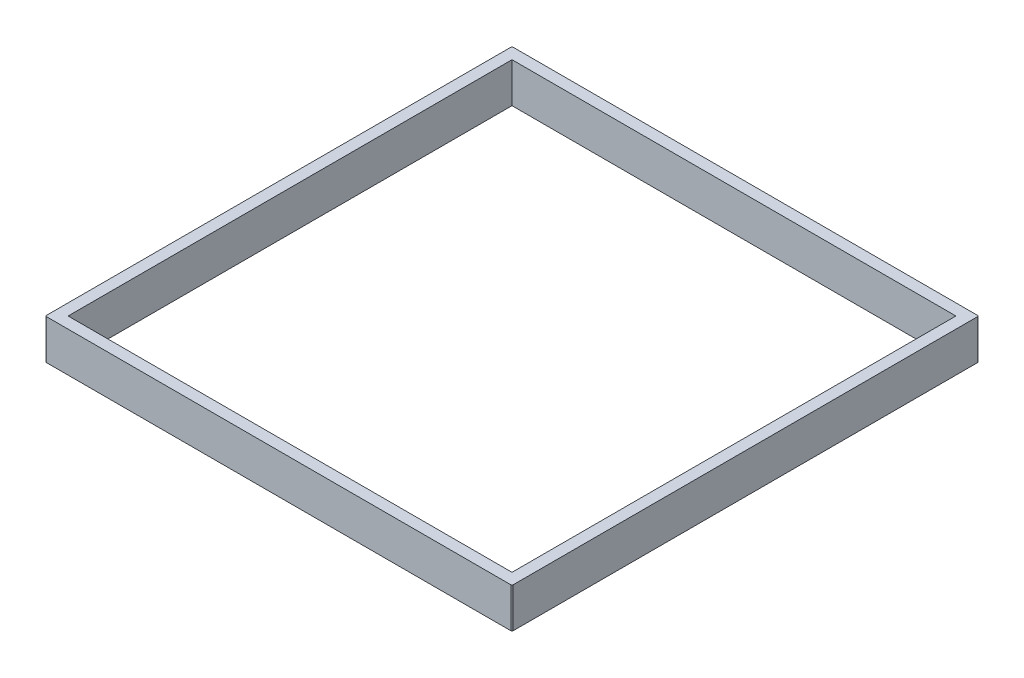
ISO-10303-21;
HEADER;
FILE_DESCRIPTION(('STEP AP214'),'2;1');
FILE_NAME('part.step','',(''),(''),'','','');
FILE_SCHEMA(('AUTOMOTIVE_DESIGN { 1 0 10303 214 1 1 1 1 }'));
ENDSEC;
DATA;
#1=APPLICATION_CONTEXT('core data for automotive mechanical design processes');
#2=APPLICATION_PROTOCOL_DEFINITION('international standard','automotive_design',2000,#1);
#3=PRODUCT_CONTEXT('',#1,'mechanical');
#4=PRODUCT('Part','Part','',(#3));
#5=PRODUCT_RELATED_PRODUCT_CATEGORY('part','',(#4));
#6=PRODUCT_DEFINITION_FORMATION('','',#4);
#7=PRODUCT_DEFINITION_CONTEXT('part definition',#1,'design');
#8=PRODUCT_DEFINITION('design','',#6,#7);
#9=PRODUCT_DEFINITION_SHAPE('','',#8);
#10=(LENGTH_UNIT() NAMED_UNIT(*) SI_UNIT(.MILLI.,.METRE.));
#11=(NAMED_UNIT(*) PLANE_ANGLE_UNIT() SI_UNIT($,.RADIAN.));
#12=(NAMED_UNIT(*) SI_UNIT($,.STERADIAN.) SOLID_ANGLE_UNIT());
#13=UNCERTAINTY_MEASURE_WITH_UNIT(LENGTH_MEASURE(1.E-05),#10,'distance_accuracy_value','');
#14=(GEOMETRIC_REPRESENTATION_CONTEXT(3) GLOBAL_UNCERTAINTY_ASSIGNED_CONTEXT((#13)) GLOBAL_UNIT_ASSIGNED_CONTEXT((#10,
#11,#12)) REPRESENTATION_CONTEXT('',''));
#15=CARTESIAN_POINT('',(0.,0.,0.));
#16=DIRECTION('',(0.,0.,1.));
#17=DIRECTION('',(1.,0.,0.));
#18=AXIS2_PLACEMENT_3D('',#15,#16,#17);
#19=CARTESIAN_POINT('',(81.8,7.,-70.8));
#20=DIRECTION('',(0.,-1.,0.));
#21=DIRECTION('',(0.,0.,-1.));
#22=AXIS2_PLACEMENT_3D('',#19,#20,#21);
#23=PLANE('',#22);
#24=CARTESIAN_POINT('',(81.8,7.,-70.8));
#25=DIRECTION('',(0.,1.,0.));
#26=DIRECTION('',(0.,0.,-1.));
#27=AXIS2_PLACEMENT_3D('',#24,#25,#26);
#28=CIRCLE('',#27,0.200000000000006);
#29=CARTESIAN_POINT('',(82.,7.,-70.8));
#30=VERTEX_POINT('',#29);
#31=CARTESIAN_POINT('',(81.8,7.,-71.));
#32=VERTEX_POINT('',#31);
#33=EDGE_CURVE('E158',#30,#32,#28,.T.);
#34=ORIENTED_EDGE('',*,*,#33,.T.);
#35=DIRECTION('',(-1.,0.,0.));
#36=VECTOR('',#35,1.);
#37=CARTESIAN_POINT('',(0.2,7.,-71.));
#38=LINE('',#37,#36);
#39=CARTESIAN_POINT('',(0.2,7.,-71.));
#40=VERTEX_POINT('',#39);
#41=EDGE_CURVE('E161',#32,#40,#38,.T.);
#42=ORIENTED_EDGE('',*,*,#41,.T.);
#43=CARTESIAN_POINT('',(0.2,7.,-70.8));
#44=DIRECTION('',(0.,1.,0.));
#45=DIRECTION('',(0.,0.,-1.));
#46=AXIS2_PLACEMENT_3D('',#43,#44,#45);
#47=CIRCLE('',#46,0.200000000000003);
#48=CARTESIAN_POINT('',(0.,7.,-70.8));
#49=VERTEX_POINT('',#48);
#50=EDGE_CURVE('E164',#40,#49,#47,.T.);
#51=ORIENTED_EDGE('',*,*,#50,.T.);
#52=DIRECTION('',(0.,0.,1.));
#53=VECTOR('',#52,1.);
#54=CARTESIAN_POINT('',(0.,7.,10.8));
#55=LINE('',#54,#53);
#56=CARTESIAN_POINT('',(0.,7.,10.8));
#57=VERTEX_POINT('',#56);
#58=EDGE_CURVE('E166',#49,#57,#55,.T.);
#59=ORIENTED_EDGE('',*,*,#58,.T.);
#60=CARTESIAN_POINT('',(0.2,7.,10.8));
#61=DIRECTION('',(0.,1.,0.));
#62=DIRECTION('',(0.,0.,-1.));
#63=AXIS2_PLACEMENT_3D('',#60,#61,#62);
#64=CIRCLE('',#63,0.200000000000001);
#65=CARTESIAN_POINT('',(0.2,7.,11.));
#66=VERTEX_POINT('',#65);
#67=EDGE_CURVE('E168',#57,#66,#64,.T.);
#68=ORIENTED_EDGE('',*,*,#67,.T.);
#69=DIRECTION('',(1.,0.,0.));
#70=VECTOR('',#69,1.);
#71=CARTESIAN_POINT('',(0.2,7.,11.));
#72=LINE('',#71,#70);
#73=CARTESIAN_POINT('',(81.8,7.,11.));
#74=VERTEX_POINT('',#73);
#75=EDGE_CURVE('E170',#66,#74,#72,.T.);
#76=ORIENTED_EDGE('',*,*,#75,.T.);
#77=CARTESIAN_POINT('',(81.8,7.,10.8));
#78=DIRECTION('',(0.,1.,0.));
#79=DIRECTION('',(0.,0.,1.));
#80=AXIS2_PLACEMENT_3D('',#77,#78,#79);
#81=CIRCLE('',#80,0.200000000000004);
#82=CARTESIAN_POINT('',(82.,7.,10.8));
#83=VERTEX_POINT('',#82);
#84=EDGE_CURVE('E172',#74,#83,#81,.T.);
#85=ORIENTED_EDGE('',*,*,#84,.T.);
#86=DIRECTION('',(0.,0.,-1.));
#87=VECTOR('',#86,1.);
#88=CARTESIAN_POINT('',(82.,7.,10.8));
#89=LINE('',#88,#87);
#90=EDGE_CURVE('E174',#83,#30,#89,.T.);
#91=ORIENTED_EDGE('',*,*,#90,.T.);
#92=EDGE_LOOP('',(#34,#42,#51,#59,#68,#76,#85,#91));
#93=FACE_BOUND('',#92,.T.);
#94=DIRECTION('',(0.,0.,1.));
#95=VECTOR('',#94,1.);
#96=CARTESIAN_POINT('',(2.,7.,8.99999999999999));
#97=LINE('',#96,#95);
#98=CARTESIAN_POINT('',(2.,7.,-69.));
#99=VERTEX_POINT('',#98);
#100=CARTESIAN_POINT('',(2.,7.,8.99999999999999));
#101=VERTEX_POINT('',#100);
#102=EDGE_CURVE('E122',#99,#101,#97,.T.);
#103=ORIENTED_EDGE('',*,*,#102,.F.);
#104=DIRECTION('',(-1.,0.,0.));
#105=VECTOR('',#104,1.);
#106=CARTESIAN_POINT('',(2.,7.,-69.));
#107=LINE('',#106,#105);
#108=CARTESIAN_POINT('',(80.,7.,-69.));
#109=VERTEX_POINT('',#108);
#110=EDGE_CURVE('E144',#109,#99,#107,.T.);
#111=ORIENTED_EDGE('',*,*,#110,.F.);
#112=DIRECTION('',(0.,0.,-1.));
#113=VECTOR('',#112,1.);
#114=CARTESIAN_POINT('',(80.,7.,8.99999999999999));
#115=LINE('',#114,#113);
#116=CARTESIAN_POINT('',(80.,7.,8.99999999999999));
#117=VERTEX_POINT('',#116);
#118=EDGE_CURVE('E142',#117,#109,#115,.T.);
#119=ORIENTED_EDGE('',*,*,#118,.F.);
#120=DIRECTION('',(1.,0.,0.));
#121=VECTOR('',#120,1.);
#122=CARTESIAN_POINT('',(2.,7.,8.99999999999999));
#123=LINE('',#122,#121);
#124=EDGE_CURVE('E130',#101,#117,#123,.T.);
#125=ORIENTED_EDGE('',*,*,#124,.F.);
#126=EDGE_LOOP('',(#103,#111,#119,#125));
#127=FACE_BOUND('',#126,.T.);
#128=ADVANCED_FACE('F33',(#93,#127),#23,.F.);
#129=CARTESIAN_POINT('',(81.8,0.,-70.8));
#130=DIRECTION('',(0.,-1.,0.));
#131=DIRECTION('',(0.,0.,-1.));
#132=AXIS2_PLACEMENT_3D('',#129,#130,#131);
#133=PLANE('',#132);
#134=CARTESIAN_POINT('',(81.8,0.,-70.8));
#135=DIRECTION('',(0.,1.,0.));
#136=DIRECTION('',(0.,0.,-1.));
#137=AXIS2_PLACEMENT_3D('',#134,#135,#136);
#138=CIRCLE('',#137,0.200000000000006);
#139=CARTESIAN_POINT('',(82.,0.,-70.8));
#140=VERTEX_POINT('',#139);
#141=CARTESIAN_POINT('',(81.8,0.,-71.));
#142=VERTEX_POINT('',#141);
#143=EDGE_CURVE('E138',#140,#142,#138,.T.);
#144=ORIENTED_EDGE('',*,*,#143,.F.);
#145=DIRECTION('',(0.,0.,-1.));
#146=VECTOR('',#145,1.);
#147=CARTESIAN_POINT('',(82.,0.,10.8));
#148=LINE('',#147,#146);
#149=CARTESIAN_POINT('',(82.,0.,10.8));
#150=VERTEX_POINT('',#149);
#151=EDGE_CURVE('E162',#150,#140,#148,.T.);
#152=ORIENTED_EDGE('',*,*,#151,.F.);
#153=CARTESIAN_POINT('',(81.8,0.,10.8));
#154=DIRECTION('',(0.,1.,0.));
#155=DIRECTION('',(0.,0.,1.));
#156=AXIS2_PLACEMENT_3D('',#153,#154,#155);
#157=CIRCLE('',#156,0.200000000000004);
#158=CARTESIAN_POINT('',(81.8,0.,11.));
#159=VERTEX_POINT('',#158);
#160=EDGE_CURVE('E189',#159,#150,#157,.T.);
#161=ORIENTED_EDGE('',*,*,#160,.F.);
#162=DIRECTION('',(1.,0.,0.));
#163=VECTOR('',#162,1.);
#164=CARTESIAN_POINT('',(0.2,0.,11.));
#165=LINE('',#164,#163);
#166=CARTESIAN_POINT('',(0.2,0.,11.));
#167=VERTEX_POINT('',#166);
#168=EDGE_CURVE('E187',#167,#159,#165,.T.);
#169=ORIENTED_EDGE('',*,*,#168,.F.);
#170=CARTESIAN_POINT('',(0.2,0.,10.8));
#171=DIRECTION('',(0.,1.,0.));
#172=DIRECTION('',(0.,0.,-1.));
#173=AXIS2_PLACEMENT_3D('',#170,#171,#172);
#174=CIRCLE('',#173,0.200000000000001);
#175=CARTESIAN_POINT('',(0.,0.,10.8));
#176=VERTEX_POINT('',#175);
#177=EDGE_CURVE('E185',#176,#167,#174,.T.);
#178=ORIENTED_EDGE('',*,*,#177,.F.);
#179=DIRECTION('',(0.,0.,1.));
#180=VECTOR('',#179,1.);
#181=CARTESIAN_POINT('',(0.,0.,10.8));
#182=LINE('',#181,#180);
#183=CARTESIAN_POINT('',(0.,0.,-70.8));
#184=VERTEX_POINT('',#183);
#185=EDGE_CURVE('E183',#184,#176,#182,.T.);
#186=ORIENTED_EDGE('',*,*,#185,.F.);
#187=CARTESIAN_POINT('',(0.2,0.,-70.8));
#188=DIRECTION('',(0.,1.,0.));
#189=DIRECTION('',(0.,0.,-1.));
#190=AXIS2_PLACEMENT_3D('',#187,#188,#189);
#191=CIRCLE('',#190,0.200000000000003);
#192=CARTESIAN_POINT('',(0.2,0.,-71.));
#193=VERTEX_POINT('',#192);
#194=EDGE_CURVE('E181',#193,#184,#191,.T.);
#195=ORIENTED_EDGE('',*,*,#194,.F.);
#196=DIRECTION('',(-1.,0.,0.));
#197=VECTOR('',#196,1.);
#198=CARTESIAN_POINT('',(0.2,0.,-71.));
#199=LINE('',#198,#197);
#200=EDGE_CURVE('E179',#142,#193,#199,.T.);
#201=ORIENTED_EDGE('',*,*,#200,.F.);
#202=EDGE_LOOP('',(#144,#152,#161,#169,#178,#186,#195,#201));
#203=FACE_BOUND('',#202,.T.);
#204=DIRECTION('',(-1.,0.,0.));
#205=VECTOR('',#204,1.);
#206=CARTESIAN_POINT('',(2.,0.,-69.));
#207=LINE('',#206,#205);
#208=CARTESIAN_POINT('',(80.,0.,-69.));
#209=VERTEX_POINT('',#208);
#210=CARTESIAN_POINT('',(2.,0.,-69.));
#211=VERTEX_POINT('',#210);
#212=EDGE_CURVE('E131',#209,#211,#207,.T.);
#213=ORIENTED_EDGE('',*,*,#212,.T.);
#214=DIRECTION('',(0.,0.,1.));
#215=VECTOR('',#214,1.);
#216=CARTESIAN_POINT('',(2.,0.,8.99999999999999));
#217=LINE('',#216,#215);
#218=CARTESIAN_POINT('',(2.,0.,8.99999999999999));
#219=VERTEX_POINT('',#218);
#220=EDGE_CURVE('E56',#211,#219,#217,.T.);
#221=ORIENTED_EDGE('',*,*,#220,.T.);
#222=DIRECTION('',(1.,0.,0.));
#223=VECTOR('',#222,1.);
#224=CARTESIAN_POINT('',(2.,0.,8.99999999999999));
#225=LINE('',#224,#223);
#226=CARTESIAN_POINT('',(80.,0.,8.99999999999999));
#227=VERTEX_POINT('',#226);
#228=EDGE_CURVE('E137',#219,#227,#225,.T.);
#229=ORIENTED_EDGE('',*,*,#228,.T.);
#230=DIRECTION('',(0.,0.,-1.));
#231=VECTOR('',#230,1.);
#232=CARTESIAN_POINT('',(80.,0.,8.99999999999999));
#233=LINE('',#232,#231);
#234=EDGE_CURVE('E150',#227,#209,#233,.T.);
#235=ORIENTED_EDGE('',*,*,#234,.T.);
#236=EDGE_LOOP('',(#213,#221,#229,#235));
#237=FACE_BOUND('',#236,.T.);
#238=ADVANCED_FACE('F219',(#203,#237),#133,.T.);
#239=CARTESIAN_POINT('',(81.8,7.,-70.8));
#240=DIRECTION('',(0.,-1.,0.));
#241=DIRECTION('',(0.,0.,-1.));
#242=AXIS2_PLACEMENT_3D('',#239,#240,#241);
#243=CYLINDRICAL_SURFACE('',#242,0.200000000000006);
#244=ORIENTED_EDGE('',*,*,#143,.T.);
#245=DIRECTION('',(0.,-1.,0.));
#246=VECTOR('',#245,1.);
#247=CARTESIAN_POINT('',(81.8,7.,-71.));
#248=LINE('',#247,#246);
#249=EDGE_CURVE('E11',#32,#142,#248,.T.);
#250=ORIENTED_EDGE('',*,*,#249,.F.);
#251=ORIENTED_EDGE('',*,*,#33,.F.);
#252=DIRECTION('',(0.,-1.,0.));
#253=VECTOR('',#252,1.);
#254=CARTESIAN_POINT('',(82.,7.,-70.8));
#255=LINE('',#254,#253);
#256=EDGE_CURVE('E176',#30,#140,#255,.T.);
#257=ORIENTED_EDGE('',*,*,#256,.T.);
#258=EDGE_LOOP('',(#244,#250,#251,#257));
#259=FACE_BOUND('',#258,.T.);
#260=ADVANCED_FACE('F35',(#259),#243,.T.);
#261=CARTESIAN_POINT('',(0.2,7.,-71.));
#262=DIRECTION('',(0.,0.,1.));
#263=DIRECTION('',(1.,0.,0.));
#264=AXIS2_PLACEMENT_3D('',#261,#262,#263);
#265=PLANE('',#264);
#266=ORIENTED_EDGE('',*,*,#200,.T.);
#267=DIRECTION('',(0.,-1.,0.));
#268=VECTOR('',#267,1.);
#269=CARTESIAN_POINT('',(0.2,7.,-71.));
#270=LINE('',#269,#268);
#271=EDGE_CURVE('E41',#40,#193,#270,.T.);
#272=ORIENTED_EDGE('',*,*,#271,.F.);
#273=ORIENTED_EDGE('',*,*,#41,.F.);
#274=ORIENTED_EDGE('',*,*,#249,.T.);
#275=EDGE_LOOP('',(#266,#272,#273,#274));
#276=FACE_BOUND('',#275,.T.);
#277=ADVANCED_FACE('F236',(#276),#265,.F.);
#278=CARTESIAN_POINT('',(0.2,7.,-70.8));
#279=DIRECTION('',(0.,-1.,0.));
#280=DIRECTION('',(0.,0.,-1.));
#281=AXIS2_PLACEMENT_3D('',#278,#279,#280);
#282=CYLINDRICAL_SURFACE('',#281,0.200000000000003);
#283=ORIENTED_EDGE('',*,*,#194,.T.);
#284=DIRECTION('',(0.,-1.,0.));
#285=VECTOR('',#284,1.);
#286=CARTESIAN_POINT('',(0.,7.,-70.8));
#287=LINE('',#286,#285);
#288=EDGE_CURVE('E206',#49,#184,#287,.T.);
#289=ORIENTED_EDGE('',*,*,#288,.F.);
#290=ORIENTED_EDGE('',*,*,#50,.F.);
#291=ORIENTED_EDGE('',*,*,#271,.T.);
#292=EDGE_LOOP('',(#283,#289,#290,#291));
#293=FACE_BOUND('',#292,.T.);
#294=ADVANCED_FACE('F213',(#293),#282,.T.);
#295=CARTESIAN_POINT('',(0.,7.,10.8));
#296=DIRECTION('',(1.,0.,0.));
#297=DIRECTION('',(0.,0.,-1.));
#298=AXIS2_PLACEMENT_3D('',#295,#296,#297);
#299=PLANE('',#298);
#300=ORIENTED_EDGE('',*,*,#185,.T.);
#301=DIRECTION('',(0.,-1.,0.));
#302=VECTOR('',#301,1.);
#303=CARTESIAN_POINT('',(0.,7.,10.8));
#304=LINE('',#303,#302);
#305=EDGE_CURVE('E203',#57,#176,#304,.T.);
#306=ORIENTED_EDGE('',*,*,#305,.F.);
#307=ORIENTED_EDGE('',*,*,#58,.F.);
#308=ORIENTED_EDGE('',*,*,#288,.T.);
#309=EDGE_LOOP('',(#300,#306,#307,#308));
#310=FACE_BOUND('',#309,.T.);
#311=ADVANCED_FACE('F225',(#310),#299,.F.);
#312=CARTESIAN_POINT('',(0.2,7.,10.8));
#313=DIRECTION('',(0.,-1.,0.));
#314=DIRECTION('',(0.,0.,-1.));
#315=AXIS2_PLACEMENT_3D('',#312,#313,#314);
#316=CYLINDRICAL_SURFACE('',#315,0.200000000000001);
#317=ORIENTED_EDGE('',*,*,#177,.T.);
#318=DIRECTION('',(0.,-1.,0.));
#319=VECTOR('',#318,1.);
#320=CARTESIAN_POINT('',(0.2,7.,11.));
#321=LINE('',#320,#319);
#322=EDGE_CURVE('E200',#66,#167,#321,.T.);
#323=ORIENTED_EDGE('',*,*,#322,.F.);
#324=ORIENTED_EDGE('',*,*,#67,.F.);
#325=ORIENTED_EDGE('',*,*,#305,.T.);
#326=EDGE_LOOP('',(#317,#323,#324,#325));
#327=FACE_BOUND('',#326,.T.);
#328=ADVANCED_FACE('F229',(#327),#316,.T.);
#329=CARTESIAN_POINT('',(0.2,7.,11.));
#330=DIRECTION('',(0.,0.,-1.));
#331=DIRECTION('',(-1.,0.,0.));
#332=AXIS2_PLACEMENT_3D('',#329,#330,#331);
#333=PLANE('',#332);
#334=ORIENTED_EDGE('',*,*,#168,.T.);
#335=DIRECTION('',(0.,-1.,0.));
#336=VECTOR('',#335,1.);
#337=CARTESIAN_POINT('',(81.8,7.,11.));
#338=LINE('',#337,#336);
#339=EDGE_CURVE('E197',#74,#159,#338,.T.);
#340=ORIENTED_EDGE('',*,*,#339,.F.);
#341=ORIENTED_EDGE('',*,*,#75,.F.);
#342=ORIENTED_EDGE('',*,*,#322,.T.);
#343=EDGE_LOOP('',(#334,#340,#341,#342));
#344=FACE_BOUND('',#343,.T.);
#345=ADVANCED_FACE('F249',(#344),#333,.F.);
#346=CARTESIAN_POINT('',(81.8,7.,10.8));
#347=DIRECTION('',(0.,-1.,0.));
#348=DIRECTION('',(0.,0.,-1.));
#349=AXIS2_PLACEMENT_3D('',#346,#347,#348);
#350=CYLINDRICAL_SURFACE('',#349,0.200000000000004);
#351=ORIENTED_EDGE('',*,*,#160,.T.);
#352=DIRECTION('',(0.,-1.,0.));
#353=VECTOR('',#352,1.);
#354=CARTESIAN_POINT('',(82.,7.,10.8));
#355=LINE('',#354,#353);
#356=EDGE_CURVE('E194',#83,#150,#355,.T.);
#357=ORIENTED_EDGE('',*,*,#356,.F.);
#358=ORIENTED_EDGE('',*,*,#84,.F.);
#359=ORIENTED_EDGE('',*,*,#339,.T.);
#360=EDGE_LOOP('',(#351,#357,#358,#359));
#361=FACE_BOUND('',#360,.T.);
#362=ADVANCED_FACE('F247',(#361),#350,.T.);
#363=CARTESIAN_POINT('',(82.,7.,10.8));
#364=DIRECTION('',(-1.,0.,0.));
#365=DIRECTION('',(0.,0.,1.));
#366=AXIS2_PLACEMENT_3D('',#363,#364,#365);
#367=PLANE('',#366);
#368=ORIENTED_EDGE('',*,*,#151,.T.);
#369=ORIENTED_EDGE('',*,*,#256,.F.);
#370=ORIENTED_EDGE('',*,*,#90,.F.);
#371=ORIENTED_EDGE('',*,*,#356,.T.);
#372=EDGE_LOOP('',(#368,#369,#370,#371));
#373=FACE_BOUND('',#372,.T.);
#374=ADVANCED_FACE('F242',(#373),#367,.F.);
#375=CARTESIAN_POINT('',(2.,7.,8.99999999999999));
#376=DIRECTION('',(1.,0.,0.));
#377=DIRECTION('',(0.,0.,-1.));
#378=AXIS2_PLACEMENT_3D('',#375,#376,#377);
#379=PLANE('',#378);
#380=ORIENTED_EDGE('',*,*,#220,.F.);
#381=DIRECTION('',(0.,-1.,0.));
#382=VECTOR('',#381,1.);
#383=CARTESIAN_POINT('',(2.,7.,-69.));
#384=LINE('',#383,#382);
#385=EDGE_CURVE('E126',#99,#211,#384,.T.);
#386=ORIENTED_EDGE('',*,*,#385,.F.);
#387=ORIENTED_EDGE('',*,*,#102,.T.);
#388=DIRECTION('',(0.,-1.,0.));
#389=VECTOR('',#388,1.);
#390=CARTESIAN_POINT('',(2.,7.,8.99999999999999));
#391=LINE('',#390,#389);
#392=EDGE_CURVE('E125',#101,#219,#391,.T.);
#393=ORIENTED_EDGE('',*,*,#392,.T.);
#394=EDGE_LOOP('',(#380,#386,#387,#393));
#395=FACE_BOUND('',#394,.T.);
#396=ADVANCED_FACE('F124',(#395),#379,.T.);
#397=CARTESIAN_POINT('',(2.,7.,8.99999999999999));
#398=DIRECTION('',(0.,0.,-1.));
#399=DIRECTION('',(-1.,0.,0.));
#400=AXIS2_PLACEMENT_3D('',#397,#398,#399);
#401=PLANE('',#400);
#402=ORIENTED_EDGE('',*,*,#228,.F.);
#403=ORIENTED_EDGE('',*,*,#392,.F.);
#404=ORIENTED_EDGE('',*,*,#124,.T.);
#405=DIRECTION('',(0.,-1.,0.));
#406=VECTOR('',#405,1.);
#407=CARTESIAN_POINT('',(80.,7.,8.99999999999999));
#408=LINE('',#407,#406);
#409=EDGE_CURVE('E139',#117,#227,#408,.T.);
#410=ORIENTED_EDGE('',*,*,#409,.T.);
#411=EDGE_LOOP('',(#402,#403,#404,#410));
#412=FACE_BOUND('',#411,.T.);
#413=ADVANCED_FACE('F134',(#412),#401,.T.);
#414=CARTESIAN_POINT('',(80.,7.,8.99999999999999));
#415=DIRECTION('',(-1.,0.,0.));
#416=DIRECTION('',(0.,0.,1.));
#417=AXIS2_PLACEMENT_3D('',#414,#415,#416);
#418=PLANE('',#417);
#419=ORIENTED_EDGE('',*,*,#234,.F.);
#420=ORIENTED_EDGE('',*,*,#409,.F.);
#421=ORIENTED_EDGE('',*,*,#118,.T.);
#422=DIRECTION('',(0.,-1.,0.));
#423=VECTOR('',#422,1.);
#424=CARTESIAN_POINT('',(80.,7.,-69.));
#425=LINE('',#424,#423);
#426=EDGE_CURVE('E48',#109,#209,#425,.T.);
#427=ORIENTED_EDGE('',*,*,#426,.T.);
#428=EDGE_LOOP('',(#419,#420,#421,#427));
#429=FACE_BOUND('',#428,.T.);
#430=ADVANCED_FACE('F274',(#429),#418,.T.);
#431=CARTESIAN_POINT('',(2.,7.,-69.));
#432=DIRECTION('',(0.,0.,1.));
#433=DIRECTION('',(1.,0.,0.));
#434=AXIS2_PLACEMENT_3D('',#431,#432,#433);
#435=PLANE('',#434);
#436=ORIENTED_EDGE('',*,*,#212,.F.);
#437=ORIENTED_EDGE('',*,*,#426,.F.);
#438=ORIENTED_EDGE('',*,*,#110,.T.);
#439=ORIENTED_EDGE('',*,*,#385,.T.);
#440=EDGE_LOOP('',(#436,#437,#438,#439));
#441=FACE_BOUND('',#440,.T.);
#442=ADVANCED_FACE('F278',(#441),#435,.T.);
#443=CLOSED_SHELL('',(#128,#238,#260,#277,#294,#311,#328,#345,#362,#374,#396,#413,#430,#442));
#444=MANIFOLD_SOLID_BREP('B2',#443);
#445=ADVANCED_BREP_SHAPE_REPRESENTATION('',(#18,#444),#14);
#446=SHAPE_DEFINITION_REPRESENTATION(#9,#445);
ENDSEC;
END-ISO-10303-21;
